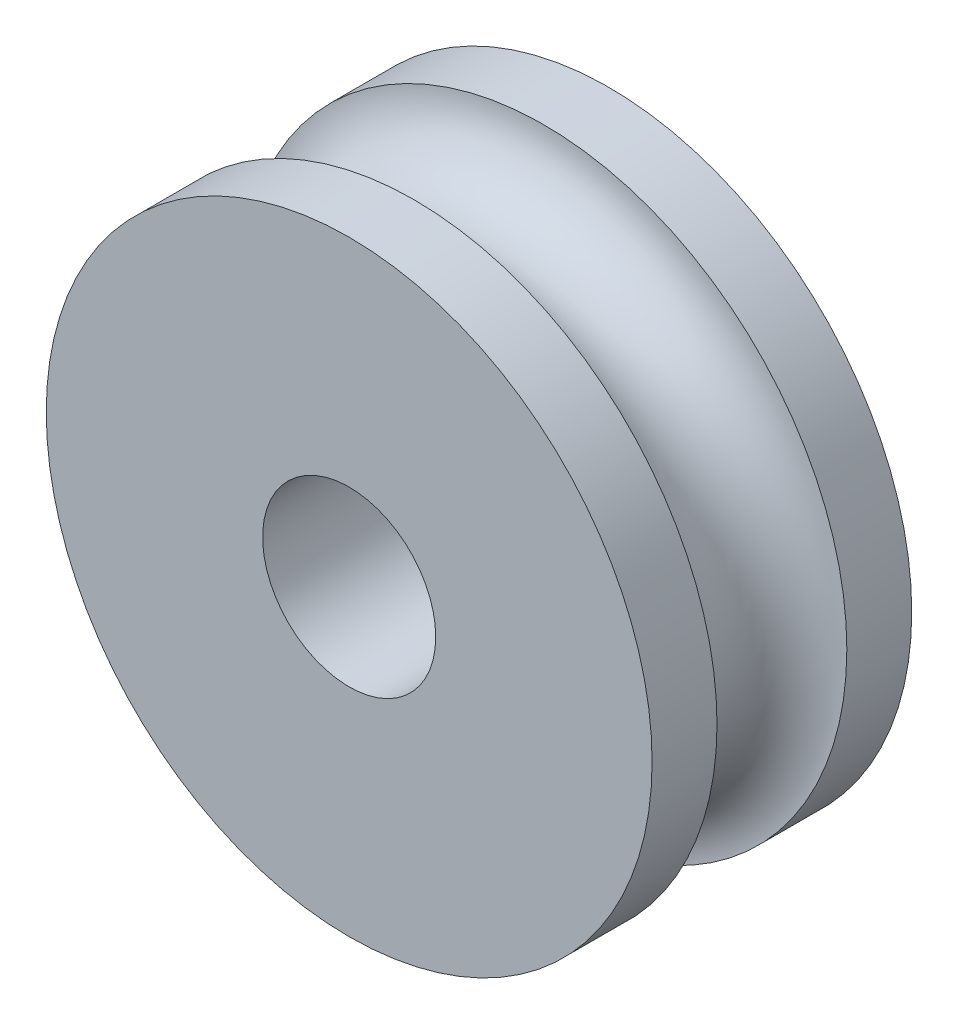
ISO-10303-21;
HEADER;
FILE_DESCRIPTION(('STEP AP214'),'2;1');
FILE_NAME('part.step','',(''),(''),'','','');
FILE_SCHEMA(('AUTOMOTIVE_DESIGN { 1 0 10303 214 1 1 1 1 }'));
ENDSEC;
DATA;
#1=APPLICATION_CONTEXT('core data for automotive mechanical design processes');
#2=APPLICATION_PROTOCOL_DEFINITION('international standard','automotive_design',2000,#1);
#3=PRODUCT_CONTEXT('',#1,'mechanical');
#4=PRODUCT('Part','Part','',(#3));
#5=PRODUCT_RELATED_PRODUCT_CATEGORY('part','',(#4));
#6=PRODUCT_DEFINITION_FORMATION('','',#4);
#7=PRODUCT_DEFINITION_CONTEXT('part definition',#1,'design');
#8=PRODUCT_DEFINITION('design','',#6,#7);
#9=PRODUCT_DEFINITION_SHAPE('','',#8);
#10=(LENGTH_UNIT() NAMED_UNIT(*) SI_UNIT(.MILLI.,.METRE.));
#11=(NAMED_UNIT(*) PLANE_ANGLE_UNIT() SI_UNIT($,.RADIAN.));
#12=(NAMED_UNIT(*) SI_UNIT($,.STERADIAN.) SOLID_ANGLE_UNIT());
#13=UNCERTAINTY_MEASURE_WITH_UNIT(LENGTH_MEASURE(1.E-05),#10,'distance_accuracy_value','');
#14=(GEOMETRIC_REPRESENTATION_CONTEXT(3) GLOBAL_UNCERTAINTY_ASSIGNED_CONTEXT((#13)) GLOBAL_UNIT_ASSIGNED_CONTEXT((#10,
#11,#12)) REPRESENTATION_CONTEXT('',''));
#15=CARTESIAN_POINT('',(0.,0.,0.));
#16=DIRECTION('',(0.,0.,1.));
#17=DIRECTION('',(1.,0.,0.));
#18=AXIS2_PLACEMENT_3D('',#15,#16,#17);
#19=CARTESIAN_POINT('',(0.,0.,3.));
#20=DIRECTION('',(0.,0.,-1.));
#21=DIRECTION('',(-1.,0.,0.));
#22=AXIS2_PLACEMENT_3D('',#19,#20,#21);
#23=CYLINDRICAL_SURFACE('',#22,3.5);
#24=CARTESIAN_POINT('',(0.,0.,3.));
#25=DIRECTION('',(0.,0.,1.));
#26=DIRECTION('',(1.,0.,0.));
#27=AXIS2_PLACEMENT_3D('',#24,#25,#26);
#28=CIRCLE('',#27,3.5);
#29=CARTESIAN_POINT('',(3.5,0.,3.));
#30=VERTEX_POINT('',#29);
#31=EDGE_CURVE('E10',#30,#30,#28,.T.);
#32=ORIENTED_EDGE('',*,*,#31,.F.);
#33=EDGE_LOOP('',(#32));
#34=FACE_BOUND('',#33,.T.);
#35=CARTESIAN_POINT('',(0.,0.,2.25));
#36=DIRECTION('',(0.,0.,-1.));
#37=DIRECTION('',(-1.,0.,0.));
#38=AXIS2_PLACEMENT_3D('',#35,#36,#37);
#39=CIRCLE('',#38,3.5);
#40=CARTESIAN_POINT('',(-3.5,0.,2.25));
#41=VERTEX_POINT('',#40);
#42=EDGE_CURVE('E34',#41,#41,#39,.T.);
#43=ORIENTED_EDGE('',*,*,#42,.F.);
#44=EDGE_LOOP('',(#43));
#45=FACE_BOUND('',#44,.T.);
#46=ADVANCED_FACE('F31',(#34,#45),#23,.T.);
#47=CARTESIAN_POINT('',(0.,0.,3.));
#48=DIRECTION('',(0.,0.,1.));
#49=DIRECTION('',(1.,0.,0.));
#50=AXIS2_PLACEMENT_3D('',#47,#48,#49);
#51=PLANE('',#50);
#52=CARTESIAN_POINT('',(0.,0.,3.));
#53=DIRECTION('',(0.,0.,1.));
#54=DIRECTION('',(1.,0.,0.));
#55=AXIS2_PLACEMENT_3D('',#52,#53,#54);
#56=CIRCLE('',#55,1.);
#57=CARTESIAN_POINT('',(1.,0.,3.));
#58=VERTEX_POINT('',#57);
#59=EDGE_CURVE('E45',#58,#58,#56,.T.);
#60=ORIENTED_EDGE('',*,*,#59,.F.);
#61=EDGE_LOOP('',(#60));
#62=FACE_BOUND('',#61,.T.);
#63=ORIENTED_EDGE('',*,*,#31,.T.);
#64=EDGE_LOOP('',(#63));
#65=FACE_BOUND('',#64,.T.);
#66=ADVANCED_FACE('F61',(#62,#65),#51,.T.);
#67=CARTESIAN_POINT('',(0.,0.,1.5));
#68=DIRECTION('',(0.,0.,1.));
#69=DIRECTION('',(1.,0.,0.));
#70=AXIS2_PLACEMENT_3D('',#67,#68,#69);
#71=TOROIDAL_SURFACE('',#70,3.5,0.75);
#72=CARTESIAN_POINT('',(0.,0.,0.75));
#73=DIRECTION('',(0.,0.,1.));
#74=DIRECTION('',(1.,0.,0.));
#75=AXIS2_PLACEMENT_3D('',#72,#73,#74);
#76=CIRCLE('',#75,3.5);
#77=CARTESIAN_POINT('',(3.5,0.,0.75));
#78=VERTEX_POINT('',#77);
#79=EDGE_CURVE('E47',#78,#78,#76,.T.);
#80=ORIENTED_EDGE('',*,*,#79,.T.);
#81=EDGE_LOOP('',(#80));
#82=FACE_BOUND('',#81,.T.);
#83=ORIENTED_EDGE('',*,*,#42,.T.);
#84=EDGE_LOOP('',(#83));
#85=FACE_BOUND('',#84,.T.);
#86=ADVANCED_FACE('F63',(#82,#85),#71,.F.);
#87=CARTESIAN_POINT('',(0.,0.,0.));
#88=DIRECTION('',(0.,0.,1.));
#89=DIRECTION('',(1.,0.,0.));
#90=AXIS2_PLACEMENT_3D('',#87,#88,#89);
#91=PLANE('',#90);
#92=CARTESIAN_POINT('',(0.,0.,0.));
#93=DIRECTION('',(0.,0.,1.));
#94=DIRECTION('',(1.,0.,0.));
#95=AXIS2_PLACEMENT_3D('',#92,#93,#94);
#96=CIRCLE('',#95,1.);
#97=CARTESIAN_POINT('',(1.,0.,0.));
#98=VERTEX_POINT('',#97);
#99=EDGE_CURVE('E49',#98,#98,#96,.T.);
#100=ORIENTED_EDGE('',*,*,#99,.T.);
#101=EDGE_LOOP('',(#100));
#102=FACE_BOUND('',#101,.T.);
#103=CARTESIAN_POINT('',(0.,0.,0.));
#104=DIRECTION('',(0.,0.,1.));
#105=DIRECTION('',(1.,0.,0.));
#106=AXIS2_PLACEMENT_3D('',#103,#104,#105);
#107=CIRCLE('',#106,3.5);
#108=CARTESIAN_POINT('',(3.5,0.,0.));
#109=VERTEX_POINT('',#108);
#110=EDGE_CURVE('E38',#109,#109,#107,.T.);
#111=ORIENTED_EDGE('',*,*,#110,.F.);
#112=EDGE_LOOP('',(#111));
#113=FACE_BOUND('',#112,.T.);
#114=ADVANCED_FACE('F69',(#102,#113),#91,.F.);
#115=ORIENTED_EDGE('',*,*,#110,.T.);
#116=EDGE_LOOP('',(#115));
#117=FACE_BOUND('',#116,.T.);
#118=ORIENTED_EDGE('',*,*,#79,.F.);
#119=EDGE_LOOP('',(#118));
#120=FACE_BOUND('',#119,.T.);
#121=ADVANCED_FACE('F72',(#117,#120),#23,.T.);
#122=CARTESIAN_POINT('',(0.,0.,0.));
#123=DIRECTION('',(0.,0.,1.));
#124=DIRECTION('',(1.,0.,0.));
#125=AXIS2_PLACEMENT_3D('',#122,#123,#124);
#126=CYLINDRICAL_SURFACE('',#125,1.);
#127=ORIENTED_EDGE('',*,*,#99,.F.);
#128=EDGE_LOOP('',(#127));
#129=FACE_BOUND('',#128,.T.);
#130=ORIENTED_EDGE('',*,*,#59,.T.);
#131=EDGE_LOOP('',(#130));
#132=FACE_BOUND('',#131,.T.);
#133=ADVANCED_FACE('F59',(#129,#132),#126,.F.);
#134=CLOSED_SHELL('',(#46,#66,#86,#114,#121,#133));
#135=MANIFOLD_SOLID_BREP('B2',#134);
#136=ADVANCED_BREP_SHAPE_REPRESENTATION('',(#18,#135),#14);
#137=SHAPE_DEFINITION_REPRESENTATION(#9,#136);
ENDSEC;
END-ISO-10303-21;
